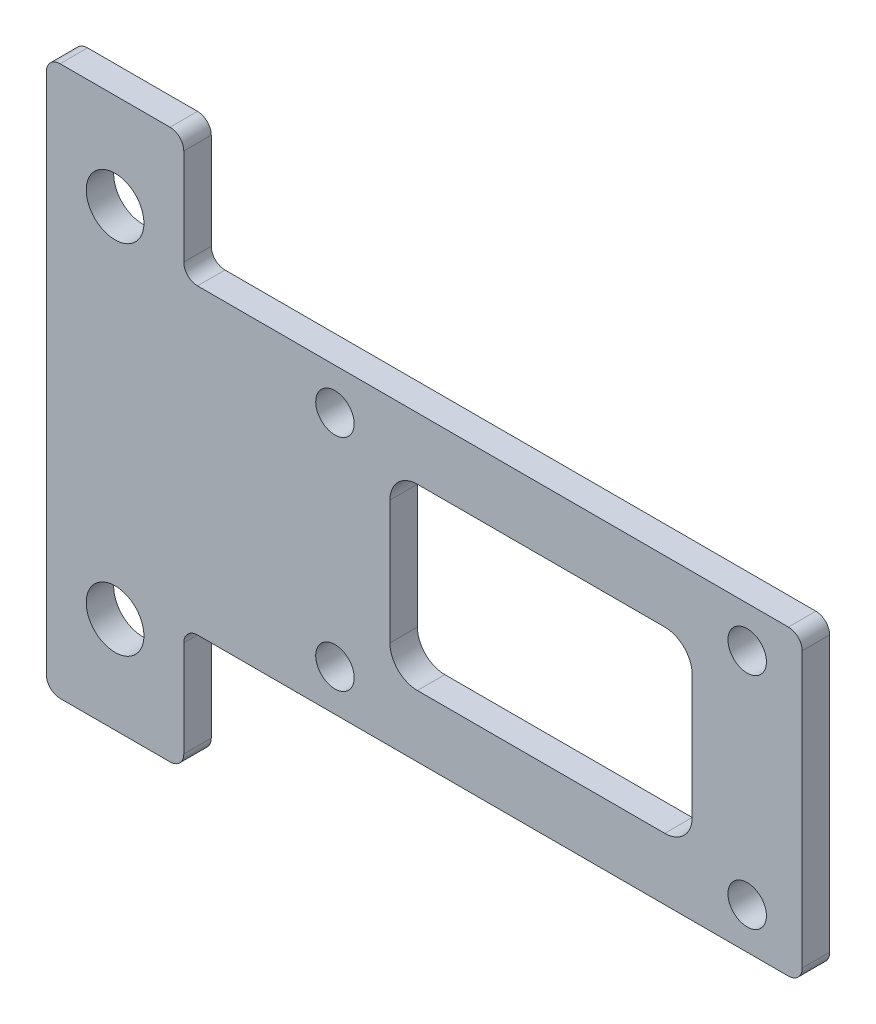
ISO-10303-21;
HEADER;
FILE_DESCRIPTION(('STEP AP214'),'2;1');
FILE_NAME('part.step','',(''),(''),'','','');
FILE_SCHEMA(('AUTOMOTIVE_DESIGN { 1 0 10303 214 1 1 1 1 }'));
ENDSEC;
DATA;
#1=APPLICATION_CONTEXT('core data for automotive mechanical design processes');
#2=APPLICATION_PROTOCOL_DEFINITION('international standard','automotive_design',2000,#1);
#3=PRODUCT_CONTEXT('',#1,'mechanical');
#4=PRODUCT('Part','Part','',(#3));
#5=PRODUCT_RELATED_PRODUCT_CATEGORY('part','',(#4));
#6=PRODUCT_DEFINITION_FORMATION('','',#4);
#7=PRODUCT_DEFINITION_CONTEXT('part definition',#1,'design');
#8=PRODUCT_DEFINITION('design','',#6,#7);
#9=PRODUCT_DEFINITION_SHAPE('','',#8);
#10=(LENGTH_UNIT() NAMED_UNIT(*) SI_UNIT(.MILLI.,.METRE.));
#11=(NAMED_UNIT(*) PLANE_ANGLE_UNIT() SI_UNIT($,.RADIAN.));
#12=(NAMED_UNIT(*) SI_UNIT($,.STERADIAN.) SOLID_ANGLE_UNIT());
#13=UNCERTAINTY_MEASURE_WITH_UNIT(LENGTH_MEASURE(1.E-05),#10,'distance_accuracy_value','');
#14=(GEOMETRIC_REPRESENTATION_CONTEXT(3) GLOBAL_UNCERTAINTY_ASSIGNED_CONTEXT((#13)) GLOBAL_UNIT_ASSIGNED_CONTEXT((#10,
#11,#12)) REPRESENTATION_CONTEXT('',''));
#15=CARTESIAN_POINT('',(0.,0.,0.));
#16=DIRECTION('',(0.,0.,1.));
#17=DIRECTION('',(1.,0.,0.));
#18=AXIS2_PLACEMENT_3D('',#15,#16,#17);
#19=CARTESIAN_POINT('',(0.,0.,2.));
#20=DIRECTION('',(0.,0.,-1.));
#21=DIRECTION('',(-1.,0.,0.));
#22=AXIS2_PLACEMENT_3D('',#19,#20,#21);
#23=PLANE('',#22);
#24=CARTESIAN_POINT('',(138.5,-22.9999999999999,2.));
#25=DIRECTION('',(0.,0.,1.));
#26=DIRECTION('',(-1.,0.,0.));
#27=AXIS2_PLACEMENT_3D('',#24,#25,#26);
#28=CIRCLE('',#27,1.4);
#29=CARTESIAN_POINT('',(137.1,-22.9999999999999,2.));
#30=VERTEX_POINT('',#29);
#31=EDGE_CURVE('E269',#30,#30,#28,.T.);
#32=ORIENTED_EDGE('',*,*,#31,.F.);
#33=EDGE_LOOP('',(#32));
#34=FACE_BOUND('',#33,.T.);
#35=CARTESIAN_POINT('',(108.5,-22.9999999999999,2.));
#36=DIRECTION('',(0.,0.,1.));
#37=DIRECTION('',(-1.,0.,0.));
#38=AXIS2_PLACEMENT_3D('',#35,#36,#37);
#39=CIRCLE('',#38,1.4);
#40=CARTESIAN_POINT('',(107.1,-22.9999999999999,2.));
#41=VERTEX_POINT('',#40);
#42=EDGE_CURVE('E275',#41,#41,#39,.T.);
#43=ORIENTED_EDGE('',*,*,#42,.F.);
#44=EDGE_LOOP('',(#43));
#45=FACE_BOUND('',#44,.T.);
#46=CARTESIAN_POINT('',(108.5,-39.,2.));
#47=DIRECTION('',(0.,0.,1.));
#48=DIRECTION('',(1.,0.,0.));
#49=AXIS2_PLACEMENT_3D('',#46,#47,#48);
#50=CIRCLE('',#49,1.4);
#51=CARTESIAN_POINT('',(109.9,-39.,2.));
#52=VERTEX_POINT('',#51);
#53=EDGE_CURVE('E281',#52,#52,#50,.T.);
#54=ORIENTED_EDGE('',*,*,#53,.F.);
#55=EDGE_LOOP('',(#54));
#56=FACE_BOUND('',#55,.T.);
#57=CARTESIAN_POINT('',(138.5,-39.,2.));
#58=DIRECTION('',(0.,0.,1.));
#59=DIRECTION('',(1.,0.,0.));
#60=AXIS2_PLACEMENT_3D('',#57,#58,#59);
#61=CIRCLE('',#60,1.4);
#62=CARTESIAN_POINT('',(139.9,-39.,2.));
#63=VERTEX_POINT('',#62);
#64=EDGE_CURVE('E287',#63,#63,#61,.T.);
#65=ORIENTED_EDGE('',*,*,#64,.F.);
#66=EDGE_LOOP('',(#65));
#67=FACE_BOUND('',#66,.T.);
#68=CARTESIAN_POINT('',(92.5000000000002,-44.0000000000001,2.));
#69=DIRECTION('',(0.,0.,1.));
#70=DIRECTION('',(1.,0.,0.));
#71=AXIS2_PLACEMENT_3D('',#68,#69,#70);
#72=CIRCLE('',#71,2.1);
#73=CARTESIAN_POINT('',(94.6000000000002,-44.0000000000001,2.));
#74=VERTEX_POINT('',#73);
#75=EDGE_CURVE('E293',#74,#74,#72,.T.);
#76=ORIENTED_EDGE('',*,*,#75,.F.);
#77=EDGE_LOOP('',(#76));
#78=FACE_BOUND('',#77,.T.);
#79=CARTESIAN_POINT('',(92.5000000000002,-18.0000000000001,2.));
#80=DIRECTION('',(0.,0.,1.));
#81=DIRECTION('',(1.,0.,0.));
#82=AXIS2_PLACEMENT_3D('',#79,#80,#81);
#83=CIRCLE('',#82,2.09999999999999);
#84=CARTESIAN_POINT('',(94.6000000000002,-18.0000000000001,2.));
#85=VERTEX_POINT('',#84);
#86=EDGE_CURVE('E299',#85,#85,#83,.T.);
#87=ORIENTED_EDGE('',*,*,#86,.F.);
#88=EDGE_LOOP('',(#87));
#89=FACE_BOUND('',#88,.T.);
#90=DIRECTION('',(0.,1.,0.));
#91=VECTOR('',#90,1.);
#92=CARTESIAN_POINT('',(142.5,-42.,2.));
#93=LINE('',#92,#91);
#94=CARTESIAN_POINT('',(142.5,-41.,2.));
#95=VERTEX_POINT('',#94);
#96=CARTESIAN_POINT('',(142.5,-21.,2.));
#97=VERTEX_POINT('',#96);
#98=EDGE_CURVE('E321',#95,#97,#93,.T.);
#99=ORIENTED_EDGE('',*,*,#98,.T.);
#100=CARTESIAN_POINT('',(141.5,-21.,2.));
#101=DIRECTION('',(0.,0.,-1.));
#102=DIRECTION('',(-1.,0.,0.));
#103=AXIS2_PLACEMENT_3D('',#100,#101,#102);
#104=CIRCLE('',#103,1.);
#105=CARTESIAN_POINT('',(141.5,-20.,2.));
#106=VERTEX_POINT('',#105);
#107=EDGE_CURVE('E381',#97,#106,#104,.F.);
#108=ORIENTED_EDGE('',*,*,#107,.T.);
#109=DIRECTION('',(-1.,0.,0.));
#110=VECTOR('',#109,1.);
#111=CARTESIAN_POINT('',(97.5000000000002,-20.,2.));
#112=LINE('',#111,#110);
#113=CARTESIAN_POINT('',(98.5000000000002,-20.,2.));
#114=VERTEX_POINT('',#113);
#115=EDGE_CURVE('E324',#106,#114,#112,.T.);
#116=ORIENTED_EDGE('',*,*,#115,.T.);
#117=CARTESIAN_POINT('',(98.5000000000002,-19.,2.));
#118=DIRECTION('',(0.,0.,-1.));
#119=DIRECTION('',(-1.,0.,0.));
#120=AXIS2_PLACEMENT_3D('',#117,#118,#119);
#121=CIRCLE('',#120,1.);
#122=CARTESIAN_POINT('',(97.5000000000002,-19.,2.));
#123=VERTEX_POINT('',#122);
#124=EDGE_CURVE('E11',#114,#123,#121,.T.);
#125=ORIENTED_EDGE('',*,*,#124,.T.);
#126=DIRECTION('',(0.,1.,0.));
#127=VECTOR('',#126,1.);
#128=CARTESIAN_POINT('',(97.5000000000002,-11.,2.));
#129=LINE('',#128,#127);
#130=CARTESIAN_POINT('',(97.5000000000002,-12.,2.));
#131=VERTEX_POINT('',#130);
#132=EDGE_CURVE('E326',#123,#131,#129,.T.);
#133=ORIENTED_EDGE('',*,*,#132,.T.);
#134=CARTESIAN_POINT('',(96.5000000000002,-12.,2.));
#135=DIRECTION('',(0.,0.,-1.));
#136=DIRECTION('',(-1.,0.,0.));
#137=AXIS2_PLACEMENT_3D('',#134,#135,#136);
#138=CIRCLE('',#137,1.);
#139=CARTESIAN_POINT('',(96.5000000000002,-11.,2.));
#140=VERTEX_POINT('',#139);
#141=EDGE_CURVE('E371',#131,#140,#138,.F.);
#142=ORIENTED_EDGE('',*,*,#141,.T.);
#143=DIRECTION('',(-1.,0.,0.));
#144=VECTOR('',#143,1.);
#145=CARTESIAN_POINT('',(87.5000000000002,-11.,2.));
#146=LINE('',#145,#144);
#147=CARTESIAN_POINT('',(88.5000000000002,-11.,2.));
#148=VERTEX_POINT('',#147);
#149=EDGE_CURVE('E305',#140,#148,#146,.T.);
#150=ORIENTED_EDGE('',*,*,#149,.T.);
#151=CARTESIAN_POINT('',(88.5000000000002,-12.,2.));
#152=DIRECTION('',(0.,0.,-1.));
#153=DIRECTION('',(-1.,0.,0.));
#154=AXIS2_PLACEMENT_3D('',#151,#152,#153);
#155=CIRCLE('',#154,1.);
#156=CARTESIAN_POINT('',(87.5000000000002,-12.,2.));
#157=VERTEX_POINT('',#156);
#158=EDGE_CURVE('E373',#148,#157,#155,.F.);
#159=ORIENTED_EDGE('',*,*,#158,.T.);
#160=DIRECTION('',(0.,-1.,0.));
#161=VECTOR('',#160,1.);
#162=CARTESIAN_POINT('',(87.5000000000002,-11.,2.));
#163=LINE('',#162,#161);
#164=CARTESIAN_POINT('',(87.5000000000002,-50.,2.));
#165=VERTEX_POINT('',#164);
#166=EDGE_CURVE('E308',#157,#165,#163,.T.);
#167=ORIENTED_EDGE('',*,*,#166,.T.);
#168=CARTESIAN_POINT('',(88.5000000000002,-50.,2.));
#169=DIRECTION('',(0.,0.,-1.));
#170=DIRECTION('',(-1.,0.,0.));
#171=AXIS2_PLACEMENT_3D('',#168,#169,#170);
#172=CIRCLE('',#171,1.);
#173=CARTESIAN_POINT('',(88.5000000000002,-51.,2.));
#174=VERTEX_POINT('',#173);
#175=EDGE_CURVE('E375',#165,#174,#172,.F.);
#176=ORIENTED_EDGE('',*,*,#175,.T.);
#177=DIRECTION('',(1.,0.,0.));
#178=VECTOR('',#177,1.);
#179=CARTESIAN_POINT('',(87.5000000000002,-51.,2.));
#180=LINE('',#179,#178);
#181=CARTESIAN_POINT('',(96.5000000000002,-51.,2.));
#182=VERTEX_POINT('',#181);
#183=EDGE_CURVE('E312',#174,#182,#180,.T.);
#184=ORIENTED_EDGE('',*,*,#183,.T.);
#185=CARTESIAN_POINT('',(96.5000000000002,-50.,2.));
#186=DIRECTION('',(0.,0.,-1.));
#187=DIRECTION('',(-1.,0.,0.));
#188=AXIS2_PLACEMENT_3D('',#185,#186,#187);
#189=CIRCLE('',#188,1.);
#190=CARTESIAN_POINT('',(97.5000000000002,-50.,2.));
#191=VERTEX_POINT('',#190);
#192=EDGE_CURVE('E377',#182,#191,#189,.F.);
#193=ORIENTED_EDGE('',*,*,#192,.T.);
#194=DIRECTION('',(0.,1.,0.));
#195=VECTOR('',#194,1.);
#196=CARTESIAN_POINT('',(97.5000000000002,-51.,2.));
#197=LINE('',#196,#195);
#198=CARTESIAN_POINT('',(97.5000000000002,-43.,2.));
#199=VERTEX_POINT('',#198);
#200=EDGE_CURVE('E315',#191,#199,#197,.T.);
#201=ORIENTED_EDGE('',*,*,#200,.T.);
#202=CARTESIAN_POINT('',(98.5000000000002,-43.,2.));
#203=DIRECTION('',(0.,0.,-1.));
#204=DIRECTION('',(-1.,0.,0.));
#205=AXIS2_PLACEMENT_3D('',#202,#203,#204);
#206=CIRCLE('',#205,1.);
#207=CARTESIAN_POINT('',(98.5000000000002,-42.,2.));
#208=VERTEX_POINT('',#207);
#209=EDGE_CURVE('E414',#199,#208,#206,.T.);
#210=ORIENTED_EDGE('',*,*,#209,.T.);
#211=DIRECTION('',(1.,0.,0.));
#212=VECTOR('',#211,1.);
#213=CARTESIAN_POINT('',(97.5000000000002,-42.,2.));
#214=LINE('',#213,#212);
#215=CARTESIAN_POINT('',(141.5,-42.,2.));
#216=VERTEX_POINT('',#215);
#217=EDGE_CURVE('E318',#208,#216,#214,.T.);
#218=ORIENTED_EDGE('',*,*,#217,.T.);
#219=CARTESIAN_POINT('',(141.5,-41.,2.));
#220=DIRECTION('',(0.,0.,-1.));
#221=DIRECTION('',(-1.,0.,0.));
#222=AXIS2_PLACEMENT_3D('',#219,#220,#221);
#223=CIRCLE('',#222,1.);
#224=EDGE_CURVE('E379',#216,#95,#223,.F.);
#225=ORIENTED_EDGE('',*,*,#224,.T.);
#226=EDGE_LOOP('',(#99,#108,#116,#125,#133,#142,#150,#159,#167,#176,#184,#193,#201,#210,#218,#225));
#227=FACE_BOUND('',#226,.T.);
#228=CARTESIAN_POINT('',(114.5,-35.5,2.));
#229=DIRECTION('',(0.,0.,1.));
#230=DIRECTION('',(-1.,0.,0.));
#231=AXIS2_PLACEMENT_3D('',#228,#229,#230);
#232=CIRCLE('',#231,2.);
#233=CARTESIAN_POINT('',(112.5,-35.5,2.));
#234=VERTEX_POINT('',#233);
#235=CARTESIAN_POINT('',(114.5,-37.5,2.));
#236=VERTEX_POINT('',#235);
#237=EDGE_CURVE('E199',#234,#236,#232,.T.);
#238=ORIENTED_EDGE('',*,*,#237,.F.);
#239=DIRECTION('',(0.,-1.,0.));
#240=VECTOR('',#239,1.);
#241=CARTESIAN_POINT('',(112.5,-35.5,2.));
#242=LINE('',#241,#240);
#243=CARTESIAN_POINT('',(112.5,-26.5,2.));
#244=VERTEX_POINT('',#243);
#245=EDGE_CURVE('E235',#244,#234,#242,.T.);
#246=ORIENTED_EDGE('',*,*,#245,.F.);
#247=CARTESIAN_POINT('',(114.5,-26.5,2.));
#248=DIRECTION('',(0.,0.,1.));
#249=DIRECTION('',(1.,0.,0.));
#250=AXIS2_PLACEMENT_3D('',#247,#248,#249);
#251=CIRCLE('',#250,2.);
#252=CARTESIAN_POINT('',(114.5,-24.5,2.));
#253=VERTEX_POINT('',#252);
#254=EDGE_CURVE('E232',#253,#244,#251,.T.);
#255=ORIENTED_EDGE('',*,*,#254,.F.);
#256=DIRECTION('',(-1.,0.,0.));
#257=VECTOR('',#256,1.);
#258=CARTESIAN_POINT('',(132.5,-24.5,2.));
#259=LINE('',#258,#257);
#260=CARTESIAN_POINT('',(132.5,-24.5,2.));
#261=VERTEX_POINT('',#260);
#262=EDGE_CURVE('E230',#261,#253,#259,.T.);
#263=ORIENTED_EDGE('',*,*,#262,.F.);
#264=CARTESIAN_POINT('',(132.5,-26.5,2.));
#265=DIRECTION('',(0.,0.,1.));
#266=DIRECTION('',(1.,0.,0.));
#267=AXIS2_PLACEMENT_3D('',#264,#265,#266);
#268=CIRCLE('',#267,2.);
#269=CARTESIAN_POINT('',(134.5,-26.5,2.));
#270=VERTEX_POINT('',#269);
#271=EDGE_CURVE('E228',#270,#261,#268,.T.);
#272=ORIENTED_EDGE('',*,*,#271,.F.);
#273=DIRECTION('',(0.,1.,0.));
#274=VECTOR('',#273,1.);
#275=CARTESIAN_POINT('',(134.5,-35.5,2.));
#276=LINE('',#275,#274);
#277=CARTESIAN_POINT('',(134.5,-35.5,2.));
#278=VERTEX_POINT('',#277);
#279=EDGE_CURVE('E224',#278,#270,#276,.T.);
#280=ORIENTED_EDGE('',*,*,#279,.F.);
#281=CARTESIAN_POINT('',(132.5,-35.5,2.));
#282=DIRECTION('',(0.,0.,1.));
#283=DIRECTION('',(1.,0.,0.));
#284=AXIS2_PLACEMENT_3D('',#281,#282,#283);
#285=CIRCLE('',#284,2.);
#286=CARTESIAN_POINT('',(132.5,-37.5,2.));
#287=VERTEX_POINT('',#286);
#288=EDGE_CURVE('E222',#287,#278,#285,.T.);
#289=ORIENTED_EDGE('',*,*,#288,.F.);
#290=DIRECTION('',(1.,0.,0.));
#291=VECTOR('',#290,1.);
#292=CARTESIAN_POINT('',(132.5,-37.5,2.));
#293=LINE('',#292,#291);
#294=EDGE_CURVE('E209',#236,#287,#293,.T.);
#295=ORIENTED_EDGE('',*,*,#294,.F.);
#296=EDGE_LOOP('',(#238,#246,#255,#263,#272,#280,#289,#295));
#297=FACE_BOUND('',#296,.T.);
#298=ADVANCED_FACE('F37',(#34,#45,#56,#67,#78,#89,#227,#297),#23,.F.);
#299=CARTESIAN_POINT('',(0.,0.,0.));
#300=DIRECTION('',(0.,0.,-1.));
#301=DIRECTION('',(-1.,0.,0.));
#302=AXIS2_PLACEMENT_3D('',#299,#300,#301);
#303=PLANE('',#302);
#304=CARTESIAN_POINT('',(108.5,-22.9999999999999,0.));
#305=DIRECTION('',(0.,0.,1.));
#306=DIRECTION('',(-1.,0.,0.));
#307=AXIS2_PLACEMENT_3D('',#304,#305,#306);
#308=CIRCLE('',#307,1.4);
#309=CARTESIAN_POINT('',(107.1,-22.9999999999999,0.));
#310=VERTEX_POINT('',#309);
#311=EDGE_CURVE('E272',#310,#310,#308,.T.);
#312=ORIENTED_EDGE('',*,*,#311,.T.);
#313=EDGE_LOOP('',(#312));
#314=FACE_BOUND('',#313,.T.);
#315=CARTESIAN_POINT('',(138.5,-39.,0.));
#316=DIRECTION('',(0.,0.,1.));
#317=DIRECTION('',(1.,0.,0.));
#318=AXIS2_PLACEMENT_3D('',#315,#316,#317);
#319=CIRCLE('',#318,1.4);
#320=CARTESIAN_POINT('',(139.9,-39.,0.));
#321=VERTEX_POINT('',#320);
#322=EDGE_CURVE('E284',#321,#321,#319,.T.);
#323=ORIENTED_EDGE('',*,*,#322,.T.);
#324=EDGE_LOOP('',(#323));
#325=FACE_BOUND('',#324,.T.);
#326=CARTESIAN_POINT('',(92.5000000000002,-18.0000000000001,0.));
#327=DIRECTION('',(0.,0.,1.));
#328=DIRECTION('',(1.,0.,0.));
#329=AXIS2_PLACEMENT_3D('',#326,#327,#328);
#330=CIRCLE('',#329,2.09999999999999);
#331=CARTESIAN_POINT('',(94.6000000000002,-18.0000000000001,0.));
#332=VERTEX_POINT('',#331);
#333=EDGE_CURVE('E296',#332,#332,#330,.T.);
#334=ORIENTED_EDGE('',*,*,#333,.T.);
#335=EDGE_LOOP('',(#334));
#336=FACE_BOUND('',#335,.T.);
#337=DIRECTION('',(-1.,0.,0.));
#338=VECTOR('',#337,1.);
#339=CARTESIAN_POINT('',(97.5000000000002,-20.,0.));
#340=LINE('',#339,#338);
#341=CARTESIAN_POINT('',(141.5,-20.,0.));
#342=VERTEX_POINT('',#341);
#343=CARTESIAN_POINT('',(98.5000000000002,-20.,0.));
#344=VERTEX_POINT('',#343);
#345=EDGE_CURVE('E346',#342,#344,#340,.T.);
#346=ORIENTED_EDGE('',*,*,#345,.F.);
#347=CARTESIAN_POINT('',(141.5,-21.,0.));
#348=DIRECTION('',(0.,0.,-1.));
#349=DIRECTION('',(-1.,0.,0.));
#350=AXIS2_PLACEMENT_3D('',#347,#348,#349);
#351=CIRCLE('',#350,1.);
#352=CARTESIAN_POINT('',(142.5,-21.,0.));
#353=VERTEX_POINT('',#352);
#354=EDGE_CURVE('E364',#342,#353,#351,.T.);
#355=ORIENTED_EDGE('',*,*,#354,.T.);
#356=DIRECTION('',(0.,1.,0.));
#357=VECTOR('',#356,1.);
#358=CARTESIAN_POINT('',(142.5,-42.,0.));
#359=LINE('',#358,#357);
#360=CARTESIAN_POINT('',(142.5,-41.,0.));
#361=VERTEX_POINT('',#360);
#362=EDGE_CURVE('E343',#361,#353,#359,.T.);
#363=ORIENTED_EDGE('',*,*,#362,.F.);
#364=CARTESIAN_POINT('',(141.5,-41.,0.));
#365=DIRECTION('',(0.,0.,-1.));
#366=DIRECTION('',(-1.,0.,0.));
#367=AXIS2_PLACEMENT_3D('',#364,#365,#366);
#368=CIRCLE('',#367,1.);
#369=CARTESIAN_POINT('',(141.5,-42.,0.));
#370=VERTEX_POINT('',#369);
#371=EDGE_CURVE('E362',#361,#370,#368,.T.);
#372=ORIENTED_EDGE('',*,*,#371,.T.);
#373=DIRECTION('',(1.,0.,0.));
#374=VECTOR('',#373,1.);
#375=CARTESIAN_POINT('',(97.5000000000002,-42.,0.));
#376=LINE('',#375,#374);
#377=CARTESIAN_POINT('',(98.5000000000002,-42.,0.));
#378=VERTEX_POINT('',#377);
#379=EDGE_CURVE('E340',#378,#370,#376,.T.);
#380=ORIENTED_EDGE('',*,*,#379,.F.);
#381=CARTESIAN_POINT('',(98.5000000000002,-43.,0.));
#382=DIRECTION('',(0.,0.,-1.));
#383=DIRECTION('',(-1.,0.,0.));
#384=AXIS2_PLACEMENT_3D('',#381,#382,#383);
#385=CIRCLE('',#384,1.);
#386=CARTESIAN_POINT('',(97.5000000000002,-43.,0.));
#387=VERTEX_POINT('',#386);
#388=EDGE_CURVE('E412',#378,#387,#385,.F.);
#389=ORIENTED_EDGE('',*,*,#388,.T.);
#390=DIRECTION('',(0.,1.,0.));
#391=VECTOR('',#390,1.);
#392=CARTESIAN_POINT('',(97.5000000000002,-51.,0.));
#393=LINE('',#392,#391);
#394=CARTESIAN_POINT('',(97.5000000000002,-50.,0.));
#395=VERTEX_POINT('',#394);
#396=EDGE_CURVE('E337',#395,#387,#393,.T.);
#397=ORIENTED_EDGE('',*,*,#396,.F.);
#398=CARTESIAN_POINT('',(96.5000000000002,-50.,0.));
#399=DIRECTION('',(0.,0.,-1.));
#400=DIRECTION('',(-1.,0.,0.));
#401=AXIS2_PLACEMENT_3D('',#398,#399,#400);
#402=CIRCLE('',#401,1.);
#403=CARTESIAN_POINT('',(96.5000000000002,-51.,0.));
#404=VERTEX_POINT('',#403);
#405=EDGE_CURVE('E360',#395,#404,#402,.T.);
#406=ORIENTED_EDGE('',*,*,#405,.T.);
#407=DIRECTION('',(1.,0.,0.));
#408=VECTOR('',#407,1.);
#409=CARTESIAN_POINT('',(87.5000000000002,-51.,0.));
#410=LINE('',#409,#408);
#411=CARTESIAN_POINT('',(88.5000000000002,-51.,0.));
#412=VERTEX_POINT('',#411);
#413=EDGE_CURVE('E334',#412,#404,#410,.T.);
#414=ORIENTED_EDGE('',*,*,#413,.F.);
#415=CARTESIAN_POINT('',(88.5000000000002,-50.,0.));
#416=DIRECTION('',(0.,0.,-1.));
#417=DIRECTION('',(-1.,0.,0.));
#418=AXIS2_PLACEMENT_3D('',#415,#416,#417);
#419=CIRCLE('',#418,1.);
#420=CARTESIAN_POINT('',(87.5000000000002,-50.,0.));
#421=VERTEX_POINT('',#420);
#422=EDGE_CURVE('E358',#412,#421,#419,.T.);
#423=ORIENTED_EDGE('',*,*,#422,.T.);
#424=DIRECTION('',(0.,-1.,0.));
#425=VECTOR('',#424,1.);
#426=CARTESIAN_POINT('',(87.5000000000002,-11.,0.));
#427=LINE('',#426,#425);
#428=CARTESIAN_POINT('',(87.5000000000002,-12.,0.));
#429=VERTEX_POINT('',#428);
#430=EDGE_CURVE('E331',#429,#421,#427,.T.);
#431=ORIENTED_EDGE('',*,*,#430,.F.);
#432=CARTESIAN_POINT('',(88.5000000000002,-12.,0.));
#433=DIRECTION('',(0.,0.,-1.));
#434=DIRECTION('',(-1.,0.,0.));
#435=AXIS2_PLACEMENT_3D('',#432,#433,#434);
#436=CIRCLE('',#435,1.);
#437=CARTESIAN_POINT('',(88.5000000000002,-11.,0.));
#438=VERTEX_POINT('',#437);
#439=EDGE_CURVE('E356',#429,#438,#436,.T.);
#440=ORIENTED_EDGE('',*,*,#439,.T.);
#441=DIRECTION('',(-1.,0.,0.));
#442=VECTOR('',#441,1.);
#443=CARTESIAN_POINT('',(87.5000000000002,-11.,0.));
#444=LINE('',#443,#442);
#445=CARTESIAN_POINT('',(96.5000000000002,-11.,0.));
#446=VERTEX_POINT('',#445);
#447=EDGE_CURVE('E302',#446,#438,#444,.T.);
#448=ORIENTED_EDGE('',*,*,#447,.F.);
#449=CARTESIAN_POINT('',(96.5000000000002,-12.,0.));
#450=DIRECTION('',(0.,0.,-1.));
#451=DIRECTION('',(-1.,0.,0.));
#452=AXIS2_PLACEMENT_3D('',#449,#450,#451);
#453=CIRCLE('',#452,1.);
#454=CARTESIAN_POINT('',(97.5000000000002,-12.,0.));
#455=VERTEX_POINT('',#454);
#456=EDGE_CURVE('E354',#446,#455,#453,.T.);
#457=ORIENTED_EDGE('',*,*,#456,.T.);
#458=DIRECTION('',(0.,1.,0.));
#459=VECTOR('',#458,1.);
#460=CARTESIAN_POINT('',(97.5000000000002,-11.,0.));
#461=LINE('',#460,#459);
#462=CARTESIAN_POINT('',(97.5000000000002,-19.,0.));
#463=VERTEX_POINT('',#462);
#464=EDGE_CURVE('E309',#463,#455,#461,.T.);
#465=ORIENTED_EDGE('',*,*,#464,.F.);
#466=CARTESIAN_POINT('',(98.5000000000002,-19.,0.));
#467=DIRECTION('',(0.,0.,-1.));
#468=DIRECTION('',(-1.,0.,0.));
#469=AXIS2_PLACEMENT_3D('',#466,#467,#468);
#470=CIRCLE('',#469,1.);
#471=EDGE_CURVE('E45',#463,#344,#470,.F.);
#472=ORIENTED_EDGE('',*,*,#471,.T.);
#473=EDGE_LOOP('',(#346,#355,#363,#372,#380,#389,#397,#406,#414,#423,#431,#440,#448,#457,#465,#472));
#474=FACE_BOUND('',#473,.T.);
#475=CARTESIAN_POINT('',(92.5000000000002,-44.0000000000001,0.));
#476=DIRECTION('',(0.,0.,1.));
#477=DIRECTION('',(1.,0.,0.));
#478=AXIS2_PLACEMENT_3D('',#475,#476,#477);
#479=CIRCLE('',#478,2.1);
#480=CARTESIAN_POINT('',(94.6000000000002,-44.0000000000001,0.));
#481=VERTEX_POINT('',#480);
#482=EDGE_CURVE('E290',#481,#481,#479,.T.);
#483=ORIENTED_EDGE('',*,*,#482,.T.);
#484=EDGE_LOOP('',(#483));
#485=FACE_BOUND('',#484,.T.);
#486=CARTESIAN_POINT('',(108.5,-39.,0.));
#487=DIRECTION('',(0.,0.,1.));
#488=DIRECTION('',(1.,0.,0.));
#489=AXIS2_PLACEMENT_3D('',#486,#487,#488);
#490=CIRCLE('',#489,1.4);
#491=CARTESIAN_POINT('',(109.9,-39.,0.));
#492=VERTEX_POINT('',#491);
#493=EDGE_CURVE('E278',#492,#492,#490,.T.);
#494=ORIENTED_EDGE('',*,*,#493,.T.);
#495=EDGE_LOOP('',(#494));
#496=FACE_BOUND('',#495,.T.);
#497=CARTESIAN_POINT('',(138.5,-22.9999999999999,0.));
#498=DIRECTION('',(0.,0.,1.));
#499=DIRECTION('',(-1.,0.,0.));
#500=AXIS2_PLACEMENT_3D('',#497,#498,#499);
#501=CIRCLE('',#500,1.4);
#502=CARTESIAN_POINT('',(137.1,-22.9999999999999,0.));
#503=VERTEX_POINT('',#502);
#504=EDGE_CURVE('E217',#503,#503,#501,.T.);
#505=ORIENTED_EDGE('',*,*,#504,.T.);
#506=EDGE_LOOP('',(#505));
#507=FACE_BOUND('',#506,.T.);
#508=DIRECTION('',(0.,-1.,0.));
#509=VECTOR('',#508,1.);
#510=CARTESIAN_POINT('',(112.5,-35.5,0.));
#511=LINE('',#510,#509);
#512=CARTESIAN_POINT('',(112.5,-26.5,0.));
#513=VERTEX_POINT('',#512);
#514=CARTESIAN_POINT('',(112.5,-35.5,0.));
#515=VERTEX_POINT('',#514);
#516=EDGE_CURVE('E210',#513,#515,#511,.T.);
#517=ORIENTED_EDGE('',*,*,#516,.T.);
#518=CARTESIAN_POINT('',(114.5,-35.5,0.));
#519=DIRECTION('',(0.,0.,1.));
#520=DIRECTION('',(-1.,0.,0.));
#521=AXIS2_PLACEMENT_3D('',#518,#519,#520);
#522=CIRCLE('',#521,2.);
#523=CARTESIAN_POINT('',(114.5,-37.5,0.));
#524=VERTEX_POINT('',#523);
#525=EDGE_CURVE('E237',#515,#524,#522,.T.);
#526=ORIENTED_EDGE('',*,*,#525,.T.);
#527=DIRECTION('',(1.,0.,0.));
#528=VECTOR('',#527,1.);
#529=CARTESIAN_POINT('',(132.5,-37.5,0.));
#530=LINE('',#529,#528);
#531=CARTESIAN_POINT('',(132.5,-37.5,0.));
#532=VERTEX_POINT('',#531);
#533=EDGE_CURVE('E216',#524,#532,#530,.T.);
#534=ORIENTED_EDGE('',*,*,#533,.T.);
#535=CARTESIAN_POINT('',(132.5,-35.5,0.));
#536=DIRECTION('',(0.,0.,1.));
#537=DIRECTION('',(1.,0.,0.));
#538=AXIS2_PLACEMENT_3D('',#535,#536,#537);
#539=CIRCLE('',#538,2.);
#540=CARTESIAN_POINT('',(134.5,-35.5,0.));
#541=VERTEX_POINT('',#540);
#542=EDGE_CURVE('E240',#532,#541,#539,.T.);
#543=ORIENTED_EDGE('',*,*,#542,.T.);
#544=DIRECTION('',(0.,1.,0.));
#545=VECTOR('',#544,1.);
#546=CARTESIAN_POINT('',(134.5,-35.5,0.));
#547=LINE('',#546,#545);
#548=CARTESIAN_POINT('',(134.5,-26.5,0.));
#549=VERTEX_POINT('',#548);
#550=EDGE_CURVE('E243',#541,#549,#547,.T.);
#551=ORIENTED_EDGE('',*,*,#550,.T.);
#552=CARTESIAN_POINT('',(132.5,-26.5,0.));
#553=DIRECTION('',(0.,0.,1.));
#554=DIRECTION('',(1.,0.,0.));
#555=AXIS2_PLACEMENT_3D('',#552,#553,#554);
#556=CIRCLE('',#555,2.);
#557=CARTESIAN_POINT('',(132.5,-24.5,0.));
#558=VERTEX_POINT('',#557);
#559=EDGE_CURVE('E246',#549,#558,#556,.T.);
#560=ORIENTED_EDGE('',*,*,#559,.T.);
#561=DIRECTION('',(-1.,0.,0.));
#562=VECTOR('',#561,1.);
#563=CARTESIAN_POINT('',(132.5,-24.5,0.));
#564=LINE('',#563,#562);
#565=CARTESIAN_POINT('',(114.5,-24.5,0.));
#566=VERTEX_POINT('',#565);
#567=EDGE_CURVE('E249',#558,#566,#564,.T.);
#568=ORIENTED_EDGE('',*,*,#567,.T.);
#569=CARTESIAN_POINT('',(114.5,-26.5,0.));
#570=DIRECTION('',(0.,0.,1.));
#571=DIRECTION('',(1.,0.,0.));
#572=AXIS2_PLACEMENT_3D('',#569,#570,#571);
#573=CIRCLE('',#572,2.);
#574=EDGE_CURVE('E252',#566,#513,#573,.T.);
#575=ORIENTED_EDGE('',*,*,#574,.T.);
#576=EDGE_LOOP('',(#517,#526,#534,#543,#551,#560,#568,#575));
#577=FACE_BOUND('',#576,.T.);
#578=ADVANCED_FACE('F418',(#314,#325,#336,#474,#485,#496,#507,#577),#303,.T.);
#579=CARTESIAN_POINT('',(87.5000000000002,-11.,2.));
#580=DIRECTION('',(0.,-1.,0.));
#581=DIRECTION('',(0.,0.,-1.));
#582=AXIS2_PLACEMENT_3D('',#579,#580,#581);
#583=PLANE('',#582);
#584=ORIENTED_EDGE('',*,*,#447,.T.);
#585=DIRECTION('',(0.,0.,-1.));
#586=VECTOR('',#585,1.);
#587=CARTESIAN_POINT('',(88.5000000000002,-11.,2.));
#588=LINE('',#587,#586);
#589=EDGE_CURVE('E406',#438,#148,#588,.F.);
#590=ORIENTED_EDGE('',*,*,#589,.T.);
#591=ORIENTED_EDGE('',*,*,#149,.F.);
#592=DIRECTION('',(0.,0.,-1.));
#593=VECTOR('',#592,1.);
#594=CARTESIAN_POINT('',(96.5000000000002,-11.,2.));
#595=LINE('',#594,#593);
#596=EDGE_CURVE('E403',#140,#446,#595,.T.);
#597=ORIENTED_EDGE('',*,*,#596,.T.);
#598=EDGE_LOOP('',(#584,#590,#591,#597));
#599=FACE_BOUND('',#598,.T.);
#600=ADVANCED_FACE('F435',(#599),#583,.F.);
#601=CARTESIAN_POINT('',(87.5000000000002,-11.,2.));
#602=DIRECTION('',(1.,0.,0.));
#603=DIRECTION('',(0.,0.,-1.));
#604=AXIS2_PLACEMENT_3D('',#601,#602,#603);
#605=PLANE('',#604);
#606=ORIENTED_EDGE('',*,*,#430,.T.);
#607=DIRECTION('',(0.,0.,-1.));
#608=VECTOR('',#607,1.);
#609=CARTESIAN_POINT('',(87.5000000000002,-50.,2.));
#610=LINE('',#609,#608);
#611=EDGE_CURVE('E401',#421,#165,#610,.F.);
#612=ORIENTED_EDGE('',*,*,#611,.T.);
#613=ORIENTED_EDGE('',*,*,#166,.F.);
#614=DIRECTION('',(0.,0.,-1.));
#615=VECTOR('',#614,1.);
#616=CARTESIAN_POINT('',(87.5000000000002,-12.,2.));
#617=LINE('',#616,#615);
#618=EDGE_CURVE('E398',#157,#429,#617,.T.);
#619=ORIENTED_EDGE('',*,*,#618,.T.);
#620=EDGE_LOOP('',(#606,#612,#613,#619));
#621=FACE_BOUND('',#620,.T.);
#622=ADVANCED_FACE('F444',(#621),#605,.F.);
#623=CARTESIAN_POINT('',(87.5000000000002,-51.,2.));
#624=DIRECTION('',(0.,1.,0.));
#625=DIRECTION('',(0.,0.,1.));
#626=AXIS2_PLACEMENT_3D('',#623,#624,#625);
#627=PLANE('',#626);
#628=ORIENTED_EDGE('',*,*,#413,.T.);
#629=DIRECTION('',(0.,0.,-1.));
#630=VECTOR('',#629,1.);
#631=CARTESIAN_POINT('',(96.5000000000002,-51.,2.));
#632=LINE('',#631,#630);
#633=EDGE_CURVE('E396',#404,#182,#632,.F.);
#634=ORIENTED_EDGE('',*,*,#633,.T.);
#635=ORIENTED_EDGE('',*,*,#183,.F.);
#636=DIRECTION('',(0.,0.,-1.));
#637=VECTOR('',#636,1.);
#638=CARTESIAN_POINT('',(88.5000000000002,-51.,2.));
#639=LINE('',#638,#637);
#640=EDGE_CURVE('E393',#174,#412,#639,.T.);
#641=ORIENTED_EDGE('',*,*,#640,.T.);
#642=EDGE_LOOP('',(#628,#634,#635,#641));
#643=FACE_BOUND('',#642,.T.);
#644=ADVANCED_FACE('F453',(#643),#627,.F.);
#645=CARTESIAN_POINT('',(97.5000000000002,-51.,2.));
#646=DIRECTION('',(-1.,0.,0.));
#647=DIRECTION('',(0.,0.,1.));
#648=AXIS2_PLACEMENT_3D('',#645,#646,#647);
#649=PLANE('',#648);
#650=ORIENTED_EDGE('',*,*,#396,.T.);
#651=DIRECTION('',(0.,0.,-1.));
#652=VECTOR('',#651,1.);
#653=CARTESIAN_POINT('',(97.5000000000002,-43.,2.));
#654=LINE('',#653,#652);
#655=EDGE_CURVE('E391',#387,#199,#654,.F.);
#656=ORIENTED_EDGE('',*,*,#655,.T.);
#657=ORIENTED_EDGE('',*,*,#200,.F.);
#658=DIRECTION('',(0.,0.,-1.));
#659=VECTOR('',#658,1.);
#660=CARTESIAN_POINT('',(97.5000000000002,-50.,2.));
#661=LINE('',#660,#659);
#662=EDGE_CURVE('E388',#191,#395,#661,.T.);
#663=ORIENTED_EDGE('',*,*,#662,.T.);
#664=EDGE_LOOP('',(#650,#656,#657,#663));
#665=FACE_BOUND('',#664,.T.);
#666=ADVANCED_FACE('F462',(#665),#649,.F.);
#667=CARTESIAN_POINT('',(97.5000000000002,-42.,2.));
#668=DIRECTION('',(0.,1.,0.));
#669=DIRECTION('',(0.,0.,1.));
#670=AXIS2_PLACEMENT_3D('',#667,#668,#669);
#671=PLANE('',#670);
#672=ORIENTED_EDGE('',*,*,#379,.T.);
#673=DIRECTION('',(0.,0.,-1.));
#674=VECTOR('',#673,1.);
#675=CARTESIAN_POINT('',(141.5,-42.,2.));
#676=LINE('',#675,#674);
#677=EDGE_CURVE('E386',#370,#216,#676,.F.);
#678=ORIENTED_EDGE('',*,*,#677,.T.);
#679=ORIENTED_EDGE('',*,*,#217,.F.);
#680=DIRECTION('',(0.,0.,-1.));
#681=VECTOR('',#680,1.);
#682=CARTESIAN_POINT('',(98.5000000000002,-42.,0.));
#683=LINE('',#682,#681);
#684=EDGE_CURVE('E383',#208,#378,#683,.T.);
#685=ORIENTED_EDGE('',*,*,#684,.T.);
#686=EDGE_LOOP('',(#672,#678,#679,#685));
#687=FACE_BOUND('',#686,.T.);
#688=ADVANCED_FACE('F471',(#687),#671,.F.);
#689=CARTESIAN_POINT('',(142.5,-42.,2.));
#690=DIRECTION('',(-1.,0.,0.));
#691=DIRECTION('',(0.,0.,1.));
#692=AXIS2_PLACEMENT_3D('',#689,#690,#691);
#693=PLANE('',#692);
#694=ORIENTED_EDGE('',*,*,#362,.T.);
#695=DIRECTION('',(0.,0.,-1.));
#696=VECTOR('',#695,1.);
#697=CARTESIAN_POINT('',(142.5,-21.,2.));
#698=LINE('',#697,#696);
#699=EDGE_CURVE('E369',#353,#97,#698,.F.);
#700=ORIENTED_EDGE('',*,*,#699,.T.);
#701=ORIENTED_EDGE('',*,*,#98,.F.);
#702=DIRECTION('',(0.,0.,-1.));
#703=VECTOR('',#702,1.);
#704=CARTESIAN_POINT('',(142.5,-41.,2.));
#705=LINE('',#704,#703);
#706=EDGE_CURVE('E366',#95,#361,#705,.T.);
#707=ORIENTED_EDGE('',*,*,#706,.T.);
#708=EDGE_LOOP('',(#694,#700,#701,#707));
#709=FACE_BOUND('',#708,.T.);
#710=ADVANCED_FACE('F480',(#709),#693,.F.);
#711=CARTESIAN_POINT('',(97.5000000000002,-20.,2.));
#712=DIRECTION('',(0.,-1.,0.));
#713=DIRECTION('',(0.,0.,-1.));
#714=AXIS2_PLACEMENT_3D('',#711,#712,#713);
#715=PLANE('',#714);
#716=ORIENTED_EDGE('',*,*,#115,.F.);
#717=DIRECTION('',(0.,0.,-1.));
#718=VECTOR('',#717,1.);
#719=CARTESIAN_POINT('',(141.5,-20.,2.));
#720=LINE('',#719,#718);
#721=EDGE_CURVE('E351',#106,#342,#720,.T.);
#722=ORIENTED_EDGE('',*,*,#721,.T.);
#723=ORIENTED_EDGE('',*,*,#345,.T.);
#724=DIRECTION('',(0.,0.,-1.));
#725=VECTOR('',#724,1.);
#726=CARTESIAN_POINT('',(98.5000000000002,-20.,2.));
#727=LINE('',#726,#725);
#728=EDGE_CURVE('E328',#344,#114,#727,.F.);
#729=ORIENTED_EDGE('',*,*,#728,.T.);
#730=EDGE_LOOP('',(#716,#722,#723,#729));
#731=FACE_BOUND('',#730,.T.);
#732=ADVANCED_FACE('F425',(#731),#715,.F.);
#733=CARTESIAN_POINT('',(97.5000000000002,-11.,2.));
#734=DIRECTION('',(-1.,0.,0.));
#735=DIRECTION('',(0.,0.,1.));
#736=AXIS2_PLACEMENT_3D('',#733,#734,#735);
#737=PLANE('',#736);
#738=ORIENTED_EDGE('',*,*,#132,.F.);
#739=DIRECTION('',(0.,0.,-1.));
#740=VECTOR('',#739,1.);
#741=CARTESIAN_POINT('',(97.5000000000002,-19.,0.));
#742=LINE('',#741,#740);
#743=EDGE_CURVE('E409',#123,#463,#742,.T.);
#744=ORIENTED_EDGE('',*,*,#743,.T.);
#745=ORIENTED_EDGE('',*,*,#464,.T.);
#746=DIRECTION('',(0.,0.,-1.));
#747=VECTOR('',#746,1.);
#748=CARTESIAN_POINT('',(97.5000000000002,-12.,2.));
#749=LINE('',#748,#747);
#750=EDGE_CURVE('E52',#455,#131,#749,.F.);
#751=ORIENTED_EDGE('',*,*,#750,.T.);
#752=EDGE_LOOP('',(#738,#744,#745,#751));
#753=FACE_BOUND('',#752,.T.);
#754=ADVANCED_FACE('F428',(#753),#737,.F.);
#755=CARTESIAN_POINT('',(92.5000000000002,-18.0000000000001,2.));
#756=DIRECTION('',(0.,0.,-1.));
#757=DIRECTION('',(-1.,0.,0.));
#758=AXIS2_PLACEMENT_3D('',#755,#756,#757);
#759=CYLINDRICAL_SURFACE('',#758,2.09999999999999);
#760=ORIENTED_EDGE('',*,*,#86,.T.);
#761=EDGE_LOOP('',(#760));
#762=FACE_BOUND('',#761,.T.);
#763=ORIENTED_EDGE('',*,*,#333,.F.);
#764=EDGE_LOOP('',(#763));
#765=FACE_BOUND('',#764,.T.);
#766=ADVANCED_FACE('F509',(#762,#765),#759,.F.);
#767=CARTESIAN_POINT('',(92.5000000000002,-44.0000000000001,2.));
#768=DIRECTION('',(0.,0.,-1.));
#769=DIRECTION('',(-1.,0.,0.));
#770=AXIS2_PLACEMENT_3D('',#767,#768,#769);
#771=CYLINDRICAL_SURFACE('',#770,2.1);
#772=ORIENTED_EDGE('',*,*,#75,.T.);
#773=EDGE_LOOP('',(#772));
#774=FACE_BOUND('',#773,.T.);
#775=ORIENTED_EDGE('',*,*,#482,.F.);
#776=EDGE_LOOP('',(#775));
#777=FACE_BOUND('',#776,.T.);
#778=ADVANCED_FACE('F564',(#774,#777),#771,.F.);
#779=CARTESIAN_POINT('',(138.5,-39.,2.));
#780=DIRECTION('',(0.,0.,-1.));
#781=DIRECTION('',(-1.,0.,0.));
#782=AXIS2_PLACEMENT_3D('',#779,#780,#781);
#783=CYLINDRICAL_SURFACE('',#782,1.4);
#784=ORIENTED_EDGE('',*,*,#64,.T.);
#785=EDGE_LOOP('',(#784));
#786=FACE_BOUND('',#785,.T.);
#787=ORIENTED_EDGE('',*,*,#322,.F.);
#788=EDGE_LOOP('',(#787));
#789=FACE_BOUND('',#788,.T.);
#790=ADVANCED_FACE('F571',(#786,#789),#783,.F.);
#791=CARTESIAN_POINT('',(108.5,-39.,2.));
#792=DIRECTION('',(0.,0.,-1.));
#793=DIRECTION('',(-1.,0.,0.));
#794=AXIS2_PLACEMENT_3D('',#791,#792,#793);
#795=CYLINDRICAL_SURFACE('',#794,1.4);
#796=ORIENTED_EDGE('',*,*,#53,.T.);
#797=EDGE_LOOP('',(#796));
#798=FACE_BOUND('',#797,.T.);
#799=ORIENTED_EDGE('',*,*,#493,.F.);
#800=EDGE_LOOP('',(#799));
#801=FACE_BOUND('',#800,.T.);
#802=ADVANCED_FACE('F578',(#798,#801),#795,.F.);
#803=CARTESIAN_POINT('',(108.5,-22.9999999999999,2.));
#804=DIRECTION('',(0.,0.,-1.));
#805=DIRECTION('',(-1.,0.,0.));
#806=AXIS2_PLACEMENT_3D('',#803,#804,#805);
#807=CYLINDRICAL_SURFACE('',#806,1.4);
#808=ORIENTED_EDGE('',*,*,#42,.T.);
#809=EDGE_LOOP('',(#808));
#810=FACE_BOUND('',#809,.T.);
#811=ORIENTED_EDGE('',*,*,#311,.F.);
#812=EDGE_LOOP('',(#811));
#813=FACE_BOUND('',#812,.T.);
#814=ADVANCED_FACE('F586',(#810,#813),#807,.F.);
#815=CARTESIAN_POINT('',(138.5,-22.9999999999999,2.));
#816=DIRECTION('',(0.,0.,-1.));
#817=DIRECTION('',(-1.,0.,0.));
#818=AXIS2_PLACEMENT_3D('',#815,#816,#817);
#819=CYLINDRICAL_SURFACE('',#818,1.4);
#820=ORIENTED_EDGE('',*,*,#31,.T.);
#821=EDGE_LOOP('',(#820));
#822=FACE_BOUND('',#821,.T.);
#823=ORIENTED_EDGE('',*,*,#504,.F.);
#824=EDGE_LOOP('',(#823));
#825=FACE_BOUND('',#824,.T.);
#826=ADVANCED_FACE('F594',(#822,#825),#819,.F.);
#827=CARTESIAN_POINT('',(114.5,-35.5,2.));
#828=DIRECTION('',(0.,0.,-1.));
#829=DIRECTION('',(-1.,0.,0.));
#830=AXIS2_PLACEMENT_3D('',#827,#828,#829);
#831=CYLINDRICAL_SURFACE('',#830,2.);
#832=ORIENTED_EDGE('',*,*,#525,.F.);
#833=DIRECTION('',(0.,0.,-1.));
#834=VECTOR('',#833,1.);
#835=CARTESIAN_POINT('',(112.5,-35.5,2.));
#836=LINE('',#835,#834);
#837=EDGE_CURVE('E205',#234,#515,#836,.T.);
#838=ORIENTED_EDGE('',*,*,#837,.F.);
#839=ORIENTED_EDGE('',*,*,#237,.T.);
#840=DIRECTION('',(0.,0.,-1.));
#841=VECTOR('',#840,1.);
#842=CARTESIAN_POINT('',(114.5,-37.5,2.));
#843=LINE('',#842,#841);
#844=EDGE_CURVE('E202',#236,#524,#843,.T.);
#845=ORIENTED_EDGE('',*,*,#844,.T.);
#846=EDGE_LOOP('',(#832,#838,#839,#845));
#847=FACE_BOUND('',#846,.T.);
#848=ADVANCED_FACE('F201',(#847),#831,.F.);
#849=CARTESIAN_POINT('',(132.5,-37.5,2.));
#850=DIRECTION('',(0.,1.,0.));
#851=DIRECTION('',(0.,0.,1.));
#852=AXIS2_PLACEMENT_3D('',#849,#850,#851);
#853=PLANE('',#852);
#854=ORIENTED_EDGE('',*,*,#533,.F.);
#855=ORIENTED_EDGE('',*,*,#844,.F.);
#856=ORIENTED_EDGE('',*,*,#294,.T.);
#857=DIRECTION('',(0.,0.,-1.));
#858=VECTOR('',#857,1.);
#859=CARTESIAN_POINT('',(132.5,-37.5,2.));
#860=LINE('',#859,#858);
#861=EDGE_CURVE('E218',#287,#532,#860,.T.);
#862=ORIENTED_EDGE('',*,*,#861,.T.);
#863=EDGE_LOOP('',(#854,#855,#856,#862));
#864=FACE_BOUND('',#863,.T.);
#865=ADVANCED_FACE('F213',(#864),#853,.T.);
#866=CARTESIAN_POINT('',(132.5,-35.5,2.));
#867=DIRECTION('',(0.,0.,-1.));
#868=DIRECTION('',(-1.,0.,0.));
#869=AXIS2_PLACEMENT_3D('',#866,#867,#868);
#870=CYLINDRICAL_SURFACE('',#869,2.);
#871=ORIENTED_EDGE('',*,*,#542,.F.);
#872=ORIENTED_EDGE('',*,*,#861,.F.);
#873=ORIENTED_EDGE('',*,*,#288,.T.);
#874=DIRECTION('',(0.,0.,-1.));
#875=VECTOR('',#874,1.);
#876=CARTESIAN_POINT('',(134.5,-35.5,2.));
#877=LINE('',#876,#875);
#878=EDGE_CURVE('E266',#278,#541,#877,.T.);
#879=ORIENTED_EDGE('',*,*,#878,.T.);
#880=EDGE_LOOP('',(#871,#872,#873,#879));
#881=FACE_BOUND('',#880,.T.);
#882=ADVANCED_FACE('F615',(#881),#870,.F.);
#883=CARTESIAN_POINT('',(134.5,-35.5,2.));
#884=DIRECTION('',(-1.,0.,0.));
#885=DIRECTION('',(0.,0.,1.));
#886=AXIS2_PLACEMENT_3D('',#883,#884,#885);
#887=PLANE('',#886);
#888=ORIENTED_EDGE('',*,*,#550,.F.);
#889=ORIENTED_EDGE('',*,*,#878,.F.);
#890=ORIENTED_EDGE('',*,*,#279,.T.);
#891=DIRECTION('',(0.,0.,-1.));
#892=VECTOR('',#891,1.);
#893=CARTESIAN_POINT('',(134.5,-26.5,2.));
#894=LINE('',#893,#892);
#895=EDGE_CURVE('E264',#270,#549,#894,.T.);
#896=ORIENTED_EDGE('',*,*,#895,.T.);
#897=EDGE_LOOP('',(#888,#889,#890,#896));
#898=FACE_BOUND('',#897,.T.);
#899=ADVANCED_FACE('F622',(#898),#887,.T.);
#900=CARTESIAN_POINT('',(132.5,-26.5,2.));
#901=DIRECTION('',(0.,0.,-1.));
#902=DIRECTION('',(-1.,0.,0.));
#903=AXIS2_PLACEMENT_3D('',#900,#901,#902);
#904=CYLINDRICAL_SURFACE('',#903,2.);
#905=ORIENTED_EDGE('',*,*,#559,.F.);
#906=ORIENTED_EDGE('',*,*,#895,.F.);
#907=ORIENTED_EDGE('',*,*,#271,.T.);
#908=DIRECTION('',(0.,0.,-1.));
#909=VECTOR('',#908,1.);
#910=CARTESIAN_POINT('',(132.5,-24.5,2.));
#911=LINE('',#910,#909);
#912=EDGE_CURVE('E262',#261,#558,#911,.T.);
#913=ORIENTED_EDGE('',*,*,#912,.T.);
#914=EDGE_LOOP('',(#905,#906,#907,#913));
#915=FACE_BOUND('',#914,.T.);
#916=ADVANCED_FACE('F630',(#915),#904,.F.);
#917=CARTESIAN_POINT('',(132.5,-24.5,2.));
#918=DIRECTION('',(0.,-1.,0.));
#919=DIRECTION('',(1.,0.,0.));
#920=AXIS2_PLACEMENT_3D('',#917,#918,#919);
#921=PLANE('',#920);
#922=ORIENTED_EDGE('',*,*,#567,.F.);
#923=ORIENTED_EDGE('',*,*,#912,.F.);
#924=ORIENTED_EDGE('',*,*,#262,.T.);
#925=DIRECTION('',(0.,0.,-1.));
#926=VECTOR('',#925,1.);
#927=CARTESIAN_POINT('',(114.5,-24.5,2.));
#928=LINE('',#927,#926);
#929=EDGE_CURVE('E260',#253,#566,#928,.T.);
#930=ORIENTED_EDGE('',*,*,#929,.T.);
#931=EDGE_LOOP('',(#922,#923,#924,#930));
#932=FACE_BOUND('',#931,.T.);
#933=ADVANCED_FACE('F638',(#932),#921,.T.);
#934=CARTESIAN_POINT('',(114.5,-26.5,2.));
#935=DIRECTION('',(0.,0.,-1.));
#936=DIRECTION('',(-1.,0.,0.));
#937=AXIS2_PLACEMENT_3D('',#934,#935,#936);
#938=CYLINDRICAL_SURFACE('',#937,2.);
#939=ORIENTED_EDGE('',*,*,#574,.F.);
#940=ORIENTED_EDGE('',*,*,#929,.F.);
#941=ORIENTED_EDGE('',*,*,#254,.T.);
#942=DIRECTION('',(0.,0.,-1.));
#943=VECTOR('',#942,1.);
#944=CARTESIAN_POINT('',(112.5,-26.5,2.));
#945=LINE('',#944,#943);
#946=EDGE_CURVE('E258',#244,#513,#945,.T.);
#947=ORIENTED_EDGE('',*,*,#946,.T.);
#948=EDGE_LOOP('',(#939,#940,#941,#947));
#949=FACE_BOUND('',#948,.T.);
#950=ADVANCED_FACE('F494',(#949),#938,.F.);
#951=CARTESIAN_POINT('',(112.5,-35.5,2.));
#952=DIRECTION('',(1.,0.,0.));
#953=DIRECTION('',(0.,0.,-1.));
#954=AXIS2_PLACEMENT_3D('',#951,#952,#953);
#955=PLANE('',#954);
#956=ORIENTED_EDGE('',*,*,#516,.F.);
#957=ORIENTED_EDGE('',*,*,#946,.F.);
#958=ORIENTED_EDGE('',*,*,#245,.T.);
#959=ORIENTED_EDGE('',*,*,#837,.T.);
#960=EDGE_LOOP('',(#956,#957,#958,#959));
#961=FACE_BOUND('',#960,.T.);
#962=ADVANCED_FACE('F486',(#961),#955,.T.);
#963=CARTESIAN_POINT('',(141.5,-21.,2.));
#964=DIRECTION('',(0.,0.,-1.));
#965=DIRECTION('',(-1.,0.,0.));
#966=AXIS2_PLACEMENT_3D('',#963,#964,#965);
#967=CYLINDRICAL_SURFACE('',#966,1.);
#968=ORIENTED_EDGE('',*,*,#107,.F.);
#969=ORIENTED_EDGE('',*,*,#699,.F.);
#970=ORIENTED_EDGE('',*,*,#354,.F.);
#971=ORIENTED_EDGE('',*,*,#721,.F.);
#972=EDGE_LOOP('',(#968,#969,#970,#971));
#973=FACE_BOUND('',#972,.T.);
#974=ADVANCED_FACE('F484',(#973),#967,.T.);
#975=CARTESIAN_POINT('',(141.5,-41.,2.));
#976=DIRECTION('',(0.,0.,-1.));
#977=DIRECTION('',(-1.,0.,0.));
#978=AXIS2_PLACEMENT_3D('',#975,#976,#977);
#979=CYLINDRICAL_SURFACE('',#978,1.);
#980=ORIENTED_EDGE('',*,*,#224,.F.);
#981=ORIENTED_EDGE('',*,*,#677,.F.);
#982=ORIENTED_EDGE('',*,*,#371,.F.);
#983=ORIENTED_EDGE('',*,*,#706,.F.);
#984=EDGE_LOOP('',(#980,#981,#982,#983));
#985=FACE_BOUND('',#984,.T.);
#986=ADVANCED_FACE('F477',(#985),#979,.T.);
#987=CARTESIAN_POINT('',(98.5000000000002,-43.,2.));
#988=DIRECTION('',(0.,0.,1.));
#989=DIRECTION('',(1.,0.,0.));
#990=AXIS2_PLACEMENT_3D('',#987,#988,#989);
#991=CYLINDRICAL_SURFACE('',#990,1.);
#992=ORIENTED_EDGE('',*,*,#209,.F.);
#993=ORIENTED_EDGE('',*,*,#655,.F.);
#994=ORIENTED_EDGE('',*,*,#388,.F.);
#995=ORIENTED_EDGE('',*,*,#684,.F.);
#996=EDGE_LOOP('',(#992,#993,#994,#995));
#997=FACE_BOUND('',#996,.T.);
#998=ADVANCED_FACE('F468',(#997),#991,.F.);
#999=CARTESIAN_POINT('',(96.5000000000002,-50.,2.));
#1000=DIRECTION('',(0.,0.,-1.));
#1001=DIRECTION('',(-1.,0.,0.));
#1002=AXIS2_PLACEMENT_3D('',#999,#1000,#1001);
#1003=CYLINDRICAL_SURFACE('',#1002,1.);
#1004=ORIENTED_EDGE('',*,*,#192,.F.);
#1005=ORIENTED_EDGE('',*,*,#633,.F.);
#1006=ORIENTED_EDGE('',*,*,#405,.F.);
#1007=ORIENTED_EDGE('',*,*,#662,.F.);
#1008=EDGE_LOOP('',(#1004,#1005,#1006,#1007));
#1009=FACE_BOUND('',#1008,.T.);
#1010=ADVANCED_FACE('F459',(#1009),#1003,.T.);
#1011=CARTESIAN_POINT('',(88.5000000000002,-50.,2.));
#1012=DIRECTION('',(0.,0.,-1.));
#1013=DIRECTION('',(-1.,0.,0.));
#1014=AXIS2_PLACEMENT_3D('',#1011,#1012,#1013);
#1015=CYLINDRICAL_SURFACE('',#1014,1.);
#1016=ORIENTED_EDGE('',*,*,#175,.F.);
#1017=ORIENTED_EDGE('',*,*,#611,.F.);
#1018=ORIENTED_EDGE('',*,*,#422,.F.);
#1019=ORIENTED_EDGE('',*,*,#640,.F.);
#1020=EDGE_LOOP('',(#1016,#1017,#1018,#1019));
#1021=FACE_BOUND('',#1020,.T.);
#1022=ADVANCED_FACE('F450',(#1021),#1015,.T.);
#1023=CARTESIAN_POINT('',(88.5000000000002,-12.,2.));
#1024=DIRECTION('',(0.,0.,-1.));
#1025=DIRECTION('',(-1.,0.,0.));
#1026=AXIS2_PLACEMENT_3D('',#1023,#1024,#1025);
#1027=CYLINDRICAL_SURFACE('',#1026,1.);
#1028=ORIENTED_EDGE('',*,*,#158,.F.);
#1029=ORIENTED_EDGE('',*,*,#589,.F.);
#1030=ORIENTED_EDGE('',*,*,#439,.F.);
#1031=ORIENTED_EDGE('',*,*,#618,.F.);
#1032=EDGE_LOOP('',(#1028,#1029,#1030,#1031));
#1033=FACE_BOUND('',#1032,.T.);
#1034=ADVANCED_FACE('F441',(#1033),#1027,.T.);
#1035=CARTESIAN_POINT('',(98.5000000000002,-19.,2.));
#1036=DIRECTION('',(0.,0.,1.));
#1037=DIRECTION('',(1.,0.,0.));
#1038=AXIS2_PLACEMENT_3D('',#1035,#1036,#1037);
#1039=CYLINDRICAL_SURFACE('',#1038,1.);
#1040=ORIENTED_EDGE('',*,*,#124,.F.);
#1041=ORIENTED_EDGE('',*,*,#728,.F.);
#1042=ORIENTED_EDGE('',*,*,#471,.F.);
#1043=ORIENTED_EDGE('',*,*,#743,.F.);
#1044=EDGE_LOOP('',(#1040,#1041,#1042,#1043));
#1045=FACE_BOUND('',#1044,.T.);
#1046=ADVANCED_FACE('F427',(#1045),#1039,.F.);
#1047=CARTESIAN_POINT('',(96.5000000000002,-12.,2.));
#1048=DIRECTION('',(0.,0.,-1.));
#1049=DIRECTION('',(-1.,0.,0.));
#1050=AXIS2_PLACEMENT_3D('',#1047,#1048,#1049);
#1051=CYLINDRICAL_SURFACE('',#1050,1.);
#1052=ORIENTED_EDGE('',*,*,#141,.F.);
#1053=ORIENTED_EDGE('',*,*,#750,.F.);
#1054=ORIENTED_EDGE('',*,*,#456,.F.);
#1055=ORIENTED_EDGE('',*,*,#596,.F.);
#1056=EDGE_LOOP('',(#1052,#1053,#1054,#1055));
#1057=FACE_BOUND('',#1056,.T.);
#1058=ADVANCED_FACE('F39',(#1057),#1051,.T.);
#1059=CLOSED_SHELL('',(#298,#578,#600,#622,#644,#666,#688,#710,#732,#754,#766,#778,#790,#802,
#814,#826,#848,#865,#882,#899,#916,#933,#950,#962,#974,#986,#998,#1010,#1022,#1034,#1046,#1058));
#1060=MANIFOLD_SOLID_BREP('B2',#1059);
#1061=ADVANCED_BREP_SHAPE_REPRESENTATION('',(#18,#1060),#14);
#1062=SHAPE_DEFINITION_REPRESENTATION(#9,#1061);
ENDSEC;
END-ISO-10303-21;
